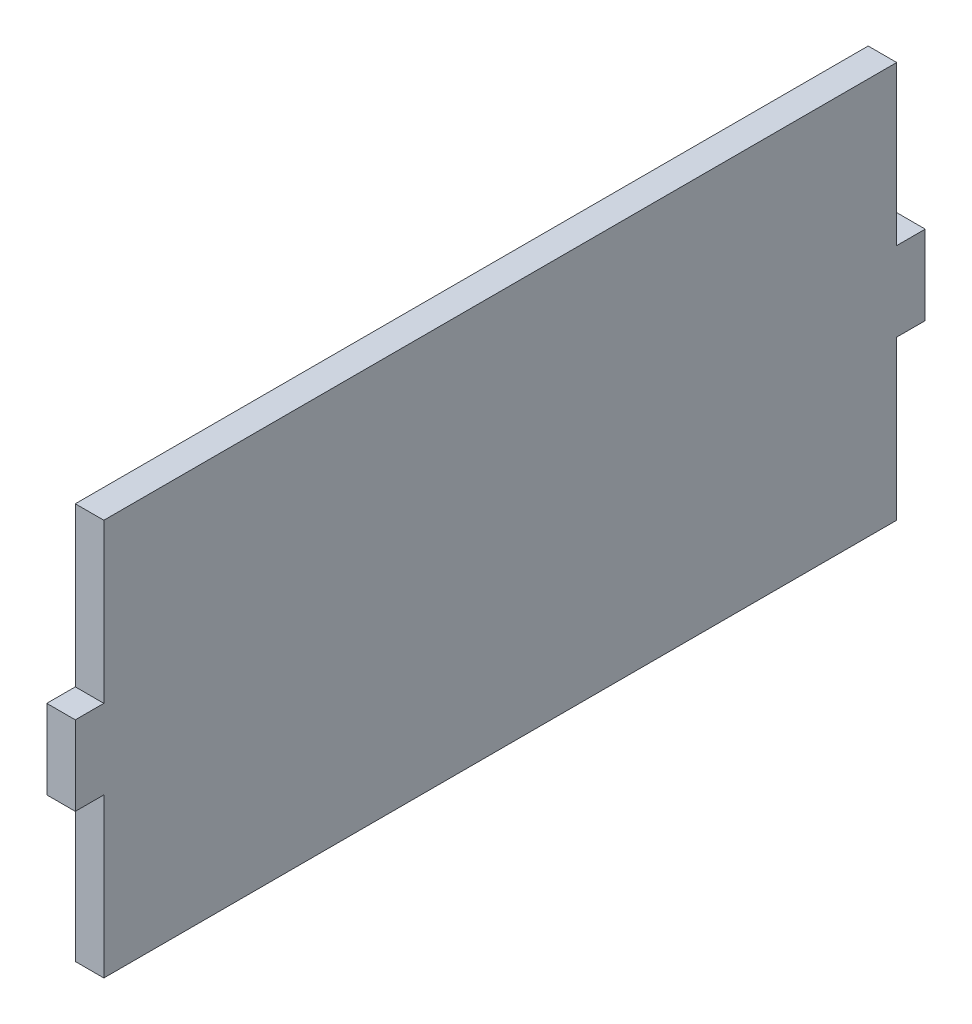
ISO-10303-21;
HEADER;
FILE_DESCRIPTION(('STEP AP214'),'2;1');
FILE_NAME('part.step','',(''),(''),'','','');
FILE_SCHEMA(('AUTOMOTIVE_DESIGN { 1 0 10303 214 1 1 1 1 }'));
ENDSEC;
DATA;
#1=APPLICATION_CONTEXT('core data for automotive mechanical design processes');
#2=APPLICATION_PROTOCOL_DEFINITION('international standard','automotive_design',2000,#1);
#3=PRODUCT_CONTEXT('',#1,'mechanical');
#4=PRODUCT('Part','Part','',(#3));
#5=PRODUCT_RELATED_PRODUCT_CATEGORY('part','',(#4));
#6=PRODUCT_DEFINITION_FORMATION('','',#4);
#7=PRODUCT_DEFINITION_CONTEXT('part definition',#1,'design');
#8=PRODUCT_DEFINITION('design','',#6,#7);
#9=PRODUCT_DEFINITION_SHAPE('','',#8);
#10=(LENGTH_UNIT() NAMED_UNIT(*) SI_UNIT(.MILLI.,.METRE.));
#11=(NAMED_UNIT(*) PLANE_ANGLE_UNIT() SI_UNIT($,.RADIAN.));
#12=(NAMED_UNIT(*) SI_UNIT($,.STERADIAN.) SOLID_ANGLE_UNIT());
#13=UNCERTAINTY_MEASURE_WITH_UNIT(LENGTH_MEASURE(1.E-05),#10,'distance_accuracy_value','');
#14=(GEOMETRIC_REPRESENTATION_CONTEXT(3) GLOBAL_UNCERTAINTY_ASSIGNED_CONTEXT((#13)) GLOBAL_UNIT_ASSIGNED_CONTEXT((#10,
#11,#12)) REPRESENTATION_CONTEXT('',''));
#15=CARTESIAN_POINT('',(0.,0.,0.));
#16=DIRECTION('',(0.,0.,1.));
#17=DIRECTION('',(1.,0.,0.));
#18=AXIS2_PLACEMENT_3D('',#15,#16,#17);
#19=CARTESIAN_POINT('',(18.,0.,0.));
#20=DIRECTION('',(0.,0.,-1.));
#21=DIRECTION('',(0.,1.,0.));
#22=AXIS2_PLACEMENT_3D('',#19,#20,#21);
#23=PLANE('',#22);
#24=DIRECTION('',(0.,-1.,0.));
#25=VECTOR('',#24,1.);
#26=CARTESIAN_POINT('',(0.,0.,0.));
#27=LINE('',#26,#25);
#28=CARTESIAN_POINT('',(0.,0.,0.));
#29=VERTEX_POINT('',#28);
#30=CARTESIAN_POINT('',(0.,-100.,0.));
#31=VERTEX_POINT('',#30);
#32=EDGE_CURVE('E153',#29,#31,#27,.T.);
#33=ORIENTED_EDGE('',*,*,#32,.T.);
#34=DIRECTION('',(-1.,0.,0.));
#35=VECTOR('',#34,1.);
#36=CARTESIAN_POINT('',(18.,-100.,0.));
#37=LINE('',#36,#35);
#38=CARTESIAN_POINT('',(18.,-100.,0.));
#39=VERTEX_POINT('',#38);
#40=EDGE_CURVE('E11',#39,#31,#37,.T.);
#41=ORIENTED_EDGE('',*,*,#40,.F.);
#42=DIRECTION('',(0.,-1.,0.));
#43=VECTOR('',#42,1.);
#44=CARTESIAN_POINT('',(18.,0.,0.));
#45=LINE('',#44,#43);
#46=CARTESIAN_POINT('',(18.,0.,0.));
#47=VERTEX_POINT('',#46);
#48=EDGE_CURVE('E175',#47,#39,#45,.T.);
#49=ORIENTED_EDGE('',*,*,#48,.F.);
#50=DIRECTION('',(-1.,0.,0.));
#51=VECTOR('',#50,1.);
#52=CARTESIAN_POINT('',(18.,0.,0.));
#53=LINE('',#52,#51);
#54=EDGE_CURVE('E149',#47,#29,#53,.T.);
#55=ORIENTED_EDGE('',*,*,#54,.T.);
#56=EDGE_LOOP('',(#33,#41,#49,#55));
#57=FACE_BOUND('',#56,.T.);
#58=ADVANCED_FACE('F33',(#57),#23,.F.);
#59=CARTESIAN_POINT('',(18.,-100.,18.));
#60=DIRECTION('',(0.,-1.,0.));
#61=DIRECTION('',(0.,0.,-1.));
#62=AXIS2_PLACEMENT_3D('',#59,#60,#61);
#63=PLANE('',#62);
#64=DIRECTION('',(0.,0.,1.));
#65=VECTOR('',#64,1.);
#66=CARTESIAN_POINT('',(0.,-100.,18.));
#67=LINE('',#66,#65);
#68=CARTESIAN_POINT('',(0.,-100.,18.));
#69=VERTEX_POINT('',#68);
#70=EDGE_CURVE('E156',#31,#69,#67,.T.);
#71=ORIENTED_EDGE('',*,*,#70,.T.);
#72=DIRECTION('',(-1.,0.,0.));
#73=VECTOR('',#72,1.);
#74=CARTESIAN_POINT('',(18.,-100.,18.));
#75=LINE('',#74,#73);
#76=CARTESIAN_POINT('',(18.,-100.,18.));
#77=VERTEX_POINT('',#76);
#78=EDGE_CURVE('E41',#77,#69,#75,.T.);
#79=ORIENTED_EDGE('',*,*,#78,.F.);
#80=DIRECTION('',(0.,0.,1.));
#81=VECTOR('',#80,1.);
#82=CARTESIAN_POINT('',(18.,-100.,18.));
#83=LINE('',#82,#81);
#84=EDGE_CURVE('E104',#39,#77,#83,.T.);
#85=ORIENTED_EDGE('',*,*,#84,.F.);
#86=ORIENTED_EDGE('',*,*,#40,.T.);
#87=EDGE_LOOP('',(#71,#79,#85,#86));
#88=FACE_BOUND('',#87,.T.);
#89=ADVANCED_FACE('F253',(#88),#63,.F.);
#90=CARTESIAN_POINT('',(18.,-100.,18.));
#91=DIRECTION('',(0.,0.,-1.));
#92=DIRECTION('',(0.,1.,0.));
#93=AXIS2_PLACEMENT_3D('',#90,#91,#92);
#94=PLANE('',#93);
#95=DIRECTION('',(0.,-1.,0.));
#96=VECTOR('',#95,1.);
#97=CARTESIAN_POINT('',(0.,-100.,18.));
#98=LINE('',#97,#96);
#99=CARTESIAN_POINT('',(0.,-150.,18.));
#100=VERTEX_POINT('',#99);
#101=EDGE_CURVE('E158',#69,#100,#98,.T.);
#102=ORIENTED_EDGE('',*,*,#101,.T.);
#103=DIRECTION('',(-1.,0.,0.));
#104=VECTOR('',#103,1.);
#105=CARTESIAN_POINT('',(18.,-150.,18.));
#106=LINE('',#105,#104);
#107=CARTESIAN_POINT('',(18.,-150.,18.));
#108=VERTEX_POINT('',#107);
#109=EDGE_CURVE('E194',#108,#100,#106,.T.);
#110=ORIENTED_EDGE('',*,*,#109,.F.);
#111=DIRECTION('',(0.,-1.,0.));
#112=VECTOR('',#111,1.);
#113=CARTESIAN_POINT('',(18.,-100.,18.));
#114=LINE('',#113,#112);
#115=EDGE_CURVE('E202',#77,#108,#114,.T.);
#116=ORIENTED_EDGE('',*,*,#115,.F.);
#117=ORIENTED_EDGE('',*,*,#78,.T.);
#118=EDGE_LOOP('',(#102,#110,#116,#117));
#119=FACE_BOUND('',#118,.T.);
#120=ADVANCED_FACE('F200',(#119),#94,.F.);
#121=CARTESIAN_POINT('',(18.,-150.,18.));
#122=DIRECTION('',(0.,1.,0.));
#123=DIRECTION('',(0.,0.,1.));
#124=AXIS2_PLACEMENT_3D('',#121,#122,#123);
#125=PLANE('',#124);
#126=DIRECTION('',(0.,0.,-1.));
#127=VECTOR('',#126,1.);
#128=CARTESIAN_POINT('',(0.,-150.,18.));
#129=LINE('',#128,#127);
#130=CARTESIAN_POINT('',(0.,-150.,0.));
#131=VERTEX_POINT('',#130);
#132=EDGE_CURVE('E160',#100,#131,#129,.T.);
#133=ORIENTED_EDGE('',*,*,#132,.T.);
#134=DIRECTION('',(-1.,0.,0.));
#135=VECTOR('',#134,1.);
#136=CARTESIAN_POINT('',(18.,-150.,0.));
#137=LINE('',#136,#135);
#138=CARTESIAN_POINT('',(18.,-150.,0.));
#139=VERTEX_POINT('',#138);
#140=EDGE_CURVE('E191',#139,#131,#137,.T.);
#141=ORIENTED_EDGE('',*,*,#140,.F.);
#142=DIRECTION('',(0.,0.,-1.));
#143=VECTOR('',#142,1.);
#144=CARTESIAN_POINT('',(18.,-150.,18.));
#145=LINE('',#144,#143);
#146=EDGE_CURVE('E220',#108,#139,#145,.T.);
#147=ORIENTED_EDGE('',*,*,#146,.F.);
#148=ORIENTED_EDGE('',*,*,#109,.T.);
#149=EDGE_LOOP('',(#133,#141,#147,#148));
#150=FACE_BOUND('',#149,.T.);
#151=ADVANCED_FACE('F211',(#150),#125,.F.);
#152=CARTESIAN_POINT('',(18.,-150.,0.));
#153=DIRECTION('',(0.,0.,-1.));
#154=DIRECTION('',(0.,1.,0.));
#155=AXIS2_PLACEMENT_3D('',#152,#153,#154);
#156=PLANE('',#155);
#157=DIRECTION('',(0.,-1.,0.));
#158=VECTOR('',#157,1.);
#159=CARTESIAN_POINT('',(0.,-150.,0.));
#160=LINE('',#159,#158);
#161=CARTESIAN_POINT('',(0.,-250.,0.));
#162=VERTEX_POINT('',#161);
#163=EDGE_CURVE('E162',#131,#162,#160,.T.);
#164=ORIENTED_EDGE('',*,*,#163,.T.);
#165=DIRECTION('',(-1.,0.,0.));
#166=VECTOR('',#165,1.);
#167=CARTESIAN_POINT('',(18.,-250.,0.));
#168=LINE('',#167,#166);
#169=CARTESIAN_POINT('',(18.,-250.,0.));
#170=VERTEX_POINT('',#169);
#171=EDGE_CURVE('E188',#170,#162,#168,.T.);
#172=ORIENTED_EDGE('',*,*,#171,.F.);
#173=DIRECTION('',(0.,-1.,0.));
#174=VECTOR('',#173,1.);
#175=CARTESIAN_POINT('',(18.,-150.,0.));
#176=LINE('',#175,#174);
#177=EDGE_CURVE('E217',#139,#170,#176,.T.);
#178=ORIENTED_EDGE('',*,*,#177,.F.);
#179=ORIENTED_EDGE('',*,*,#140,.T.);
#180=EDGE_LOOP('',(#164,#172,#178,#179));
#181=FACE_BOUND('',#180,.T.);
#182=ADVANCED_FACE('F215',(#181),#156,.F.);
#183=CARTESIAN_POINT('',(18.,-250.,0.));
#184=DIRECTION('',(0.,1.,0.));
#185=DIRECTION('',(0.,0.,1.));
#186=AXIS2_PLACEMENT_3D('',#183,#184,#185);
#187=PLANE('',#186);
#188=DIRECTION('',(0.,0.,-1.));
#189=VECTOR('',#188,1.);
#190=CARTESIAN_POINT('',(0.,-250.,0.));
#191=LINE('',#190,#189);
#192=CARTESIAN_POINT('',(0.,-250.,-500.));
#193=VERTEX_POINT('',#192);
#194=EDGE_CURVE('E164',#162,#193,#191,.T.);
#195=ORIENTED_EDGE('',*,*,#194,.T.);
#196=DIRECTION('',(-1.,0.,0.));
#197=VECTOR('',#196,1.);
#198=CARTESIAN_POINT('',(18.,-250.,-500.));
#199=LINE('',#198,#197);
#200=CARTESIAN_POINT('',(18.,-250.,-500.));
#201=VERTEX_POINT('',#200);
#202=EDGE_CURVE('E185',#201,#193,#199,.T.);
#203=ORIENTED_EDGE('',*,*,#202,.F.);
#204=DIRECTION('',(0.,0.,-1.));
#205=VECTOR('',#204,1.);
#206=CARTESIAN_POINT('',(18.,-250.,0.));
#207=LINE('',#206,#205);
#208=EDGE_CURVE('E219',#170,#201,#207,.T.);
#209=ORIENTED_EDGE('',*,*,#208,.F.);
#210=ORIENTED_EDGE('',*,*,#171,.T.);
#211=EDGE_LOOP('',(#195,#203,#209,#210));
#212=FACE_BOUND('',#211,.T.);
#213=ADVANCED_FACE('F266',(#212),#187,.F.);
#214=CARTESIAN_POINT('',(18.,-150.,-500.));
#215=DIRECTION('',(0.,0.,1.));
#216=DIRECTION('',(0.,-1.,0.));
#217=AXIS2_PLACEMENT_3D('',#214,#215,#216);
#218=PLANE('',#217);
#219=DIRECTION('',(0.,1.,0.));
#220=VECTOR('',#219,1.);
#221=CARTESIAN_POINT('',(0.,-150.,-500.));
#222=LINE('',#221,#220);
#223=CARTESIAN_POINT('',(0.,-150.,-500.));
#224=VERTEX_POINT('',#223);
#225=EDGE_CURVE('E166',#193,#224,#222,.T.);
#226=ORIENTED_EDGE('',*,*,#225,.T.);
#227=DIRECTION('',(-1.,0.,0.));
#228=VECTOR('',#227,1.);
#229=CARTESIAN_POINT('',(18.,-150.,-500.));
#230=LINE('',#229,#228);
#231=CARTESIAN_POINT('',(18.,-150.,-500.));
#232=VERTEX_POINT('',#231);
#233=EDGE_CURVE('E182',#232,#224,#230,.T.);
#234=ORIENTED_EDGE('',*,*,#233,.F.);
#235=DIRECTION('',(0.,1.,0.));
#236=VECTOR('',#235,1.);
#237=CARTESIAN_POINT('',(18.,-150.,-500.));
#238=LINE('',#237,#236);
#239=EDGE_CURVE('E222',#201,#232,#238,.T.);
#240=ORIENTED_EDGE('',*,*,#239,.F.);
#241=ORIENTED_EDGE('',*,*,#202,.T.);
#242=EDGE_LOOP('',(#226,#234,#240,#241));
#243=FACE_BOUND('',#242,.T.);
#244=ADVANCED_FACE('F269',(#243),#218,.F.);
#245=CARTESIAN_POINT('',(18.,-150.,-518.));
#246=DIRECTION('',(0.,1.,0.));
#247=DIRECTION('',(0.,0.,1.));
#248=AXIS2_PLACEMENT_3D('',#245,#246,#247);
#249=PLANE('',#248);
#250=DIRECTION('',(0.,0.,-1.));
#251=VECTOR('',#250,1.);
#252=CARTESIAN_POINT('',(0.,-150.,-518.));
#253=LINE('',#252,#251);
#254=CARTESIAN_POINT('',(0.,-150.,-518.));
#255=VERTEX_POINT('',#254);
#256=EDGE_CURVE('E168',#224,#255,#253,.T.);
#257=ORIENTED_EDGE('',*,*,#256,.T.);
#258=DIRECTION('',(-1.,0.,0.));
#259=VECTOR('',#258,1.);
#260=CARTESIAN_POINT('',(18.,-150.,-518.));
#261=LINE('',#260,#259);
#262=CARTESIAN_POINT('',(18.,-150.,-518.));
#263=VERTEX_POINT('',#262);
#264=EDGE_CURVE('E179',#263,#255,#261,.T.);
#265=ORIENTED_EDGE('',*,*,#264,.F.);
#266=DIRECTION('',(0.,0.,-1.));
#267=VECTOR('',#266,1.);
#268=CARTESIAN_POINT('',(18.,-150.,-518.));
#269=LINE('',#268,#267);
#270=EDGE_CURVE('E228',#232,#263,#269,.T.);
#271=ORIENTED_EDGE('',*,*,#270,.F.);
#272=ORIENTED_EDGE('',*,*,#233,.T.);
#273=EDGE_LOOP('',(#257,#265,#271,#272));
#274=FACE_BOUND('',#273,.T.);
#275=ADVANCED_FACE('F234',(#274),#249,.F.);
#276=CARTESIAN_POINT('',(18.,-100.,-518.));
#277=DIRECTION('',(0.,0.,1.));
#278=DIRECTION('',(0.,-1.,0.));
#279=AXIS2_PLACEMENT_3D('',#276,#277,#278);
#280=PLANE('',#279);
#281=DIRECTION('',(0.,1.,0.));
#282=VECTOR('',#281,1.);
#283=CARTESIAN_POINT('',(0.,-100.,-518.));
#284=LINE('',#283,#282);
#285=CARTESIAN_POINT('',(0.,-100.,-518.));
#286=VERTEX_POINT('',#285);
#287=EDGE_CURVE('E170',#255,#286,#284,.T.);
#288=ORIENTED_EDGE('',*,*,#287,.T.);
#289=DIRECTION('',(-1.,0.,0.));
#290=VECTOR('',#289,1.);
#291=CARTESIAN_POINT('',(18.,-100.,-518.));
#292=LINE('',#291,#290);
#293=CARTESIAN_POINT('',(18.,-100.,-518.));
#294=VERTEX_POINT('',#293);
#295=EDGE_CURVE('E144',#294,#286,#292,.T.);
#296=ORIENTED_EDGE('',*,*,#295,.F.);
#297=DIRECTION('',(0.,1.,0.));
#298=VECTOR('',#297,1.);
#299=CARTESIAN_POINT('',(18.,-100.,-518.));
#300=LINE('',#299,#298);
#301=EDGE_CURVE('E135',#263,#294,#300,.T.);
#302=ORIENTED_EDGE('',*,*,#301,.F.);
#303=ORIENTED_EDGE('',*,*,#264,.T.);
#304=EDGE_LOOP('',(#288,#296,#302,#303));
#305=FACE_BOUND('',#304,.T.);
#306=ADVANCED_FACE('F238',(#305),#280,.F.);
#307=CARTESIAN_POINT('',(18.,-100.,-518.));
#308=DIRECTION('',(0.,-1.,0.));
#309=DIRECTION('',(0.,0.,-1.));
#310=AXIS2_PLACEMENT_3D('',#307,#308,#309);
#311=PLANE('',#310);
#312=DIRECTION('',(0.,0.,1.));
#313=VECTOR('',#312,1.);
#314=CARTESIAN_POINT('',(0.,-100.,-518.));
#315=LINE('',#314,#313);
#316=CARTESIAN_POINT('',(0.,-100.,-500.));
#317=VERTEX_POINT('',#316);
#318=EDGE_CURVE('E143',#286,#317,#315,.T.);
#319=ORIENTED_EDGE('',*,*,#318,.T.);
#320=DIRECTION('',(-1.,0.,0.));
#321=VECTOR('',#320,1.);
#322=CARTESIAN_POINT('',(18.,-100.,-500.));
#323=LINE('',#322,#321);
#324=CARTESIAN_POINT('',(18.,-100.,-500.));
#325=VERTEX_POINT('',#324);
#326=EDGE_CURVE('E140',#325,#317,#323,.T.);
#327=ORIENTED_EDGE('',*,*,#326,.F.);
#328=DIRECTION('',(0.,0.,1.));
#329=VECTOR('',#328,1.);
#330=CARTESIAN_POINT('',(18.,-100.,-518.));
#331=LINE('',#330,#329);
#332=EDGE_CURVE('E129',#294,#325,#331,.T.);
#333=ORIENTED_EDGE('',*,*,#332,.F.);
#334=ORIENTED_EDGE('',*,*,#295,.T.);
#335=EDGE_LOOP('',(#319,#327,#333,#334));
#336=FACE_BOUND('',#335,.T.);
#337=ADVANCED_FACE('F141',(#336),#311,.F.);
#338=CARTESIAN_POINT('',(18.,0.,-500.));
#339=DIRECTION('',(0.,0.,1.));
#340=DIRECTION('',(1.,0.,0.));
#341=AXIS2_PLACEMENT_3D('',#338,#339,#340);
#342=PLANE('',#341);
#343=DIRECTION('',(0.,1.,0.));
#344=VECTOR('',#343,1.);
#345=CARTESIAN_POINT('',(0.,0.,-500.));
#346=LINE('',#345,#344);
#347=CARTESIAN_POINT('',(0.,0.,-500.));
#348=VERTEX_POINT('',#347);
#349=EDGE_CURVE('E90',#317,#348,#346,.T.);
#350=ORIENTED_EDGE('',*,*,#349,.T.);
#351=DIRECTION('',(-1.,0.,0.));
#352=VECTOR('',#351,1.);
#353=CARTESIAN_POINT('',(18.,0.,-500.));
#354=LINE('',#353,#352);
#355=CARTESIAN_POINT('',(18.,0.,-500.));
#356=VERTEX_POINT('',#355);
#357=EDGE_CURVE('E145',#356,#348,#354,.T.);
#358=ORIENTED_EDGE('',*,*,#357,.F.);
#359=DIRECTION('',(0.,1.,0.));
#360=VECTOR('',#359,1.);
#361=CARTESIAN_POINT('',(18.,0.,-500.));
#362=LINE('',#361,#360);
#363=EDGE_CURVE('E133',#325,#356,#362,.T.);
#364=ORIENTED_EDGE('',*,*,#363,.F.);
#365=ORIENTED_EDGE('',*,*,#326,.T.);
#366=EDGE_LOOP('',(#350,#358,#364,#365));
#367=FACE_BOUND('',#366,.T.);
#368=ADVANCED_FACE('F147',(#367),#342,.F.);
#369=CARTESIAN_POINT('',(18.,0.,0.));
#370=DIRECTION('',(0.,-1.,0.));
#371=DIRECTION('',(0.,0.,-1.));
#372=AXIS2_PLACEMENT_3D('',#369,#370,#371);
#373=PLANE('',#372);
#374=DIRECTION('',(0.,0.,1.));
#375=VECTOR('',#374,1.);
#376=CARTESIAN_POINT('',(0.,0.,0.));
#377=LINE('',#376,#375);
#378=EDGE_CURVE('E96',#348,#29,#377,.T.);
#379=ORIENTED_EDGE('',*,*,#378,.T.);
#380=ORIENTED_EDGE('',*,*,#54,.F.);
#381=DIRECTION('',(0.,0.,1.));
#382=VECTOR('',#381,1.);
#383=CARTESIAN_POINT('',(18.,0.,0.));
#384=LINE('',#383,#382);
#385=EDGE_CURVE('E49',#356,#47,#384,.T.);
#386=ORIENTED_EDGE('',*,*,#385,.F.);
#387=ORIENTED_EDGE('',*,*,#357,.T.);
#388=EDGE_LOOP('',(#379,#380,#386,#387));
#389=FACE_BOUND('',#388,.T.);
#390=ADVANCED_FACE('F242',(#389),#373,.F.);
#391=CARTESIAN_POINT('',(18.,0.,0.));
#392=DIRECTION('',(1.,0.,0.));
#393=DIRECTION('',(0.,0.,-1.));
#394=AXIS2_PLACEMENT_3D('',#391,#392,#393);
#395=PLANE('',#394);
#396=ORIENTED_EDGE('',*,*,#48,.T.);
#397=ORIENTED_EDGE('',*,*,#84,.T.);
#398=ORIENTED_EDGE('',*,*,#115,.T.);
#399=ORIENTED_EDGE('',*,*,#146,.T.);
#400=ORIENTED_EDGE('',*,*,#177,.T.);
#401=ORIENTED_EDGE('',*,*,#208,.T.);
#402=ORIENTED_EDGE('',*,*,#239,.T.);
#403=ORIENTED_EDGE('',*,*,#270,.T.);
#404=ORIENTED_EDGE('',*,*,#301,.T.);
#405=ORIENTED_EDGE('',*,*,#332,.T.);
#406=ORIENTED_EDGE('',*,*,#363,.T.);
#407=ORIENTED_EDGE('',*,*,#385,.T.);
#408=EDGE_LOOP('',(#396,#397,#398,#399,#400,#401,#402,#403,#404,#405,#406,#407));
#409=FACE_BOUND('',#408,.T.);
#410=ADVANCED_FACE('F131',(#409),#395,.T.);
#411=CARTESIAN_POINT('',(0.,0.,0.));
#412=DIRECTION('',(1.,0.,0.));
#413=DIRECTION('',(0.,0.,-1.));
#414=AXIS2_PLACEMENT_3D('',#411,#412,#413);
#415=PLANE('',#414);
#416=ORIENTED_EDGE('',*,*,#32,.F.);
#417=ORIENTED_EDGE('',*,*,#378,.F.);
#418=ORIENTED_EDGE('',*,*,#349,.F.);
#419=ORIENTED_EDGE('',*,*,#318,.F.);
#420=ORIENTED_EDGE('',*,*,#287,.F.);
#421=ORIENTED_EDGE('',*,*,#256,.F.);
#422=ORIENTED_EDGE('',*,*,#225,.F.);
#423=ORIENTED_EDGE('',*,*,#194,.F.);
#424=ORIENTED_EDGE('',*,*,#163,.F.);
#425=ORIENTED_EDGE('',*,*,#132,.F.);
#426=ORIENTED_EDGE('',*,*,#101,.F.);
#427=ORIENTED_EDGE('',*,*,#70,.F.);
#428=EDGE_LOOP('',(#416,#417,#418,#419,#420,#421,#422,#423,#424,#425,#426,#427));
#429=FACE_BOUND('',#428,.T.);
#430=ADVANCED_FACE('F206',(#429),#415,.F.);
#431=CLOSED_SHELL('',(#58,#89,#120,#151,#182,#213,#244,#275,#306,#337,#368,#390,#410,#430));
#432=MANIFOLD_SOLID_BREP('B2',#431);
#433=ADVANCED_BREP_SHAPE_REPRESENTATION('',(#18,#432),#14);
#434=SHAPE_DEFINITION_REPRESENTATION(#9,#433);
ENDSEC;
END-ISO-10303-21;
